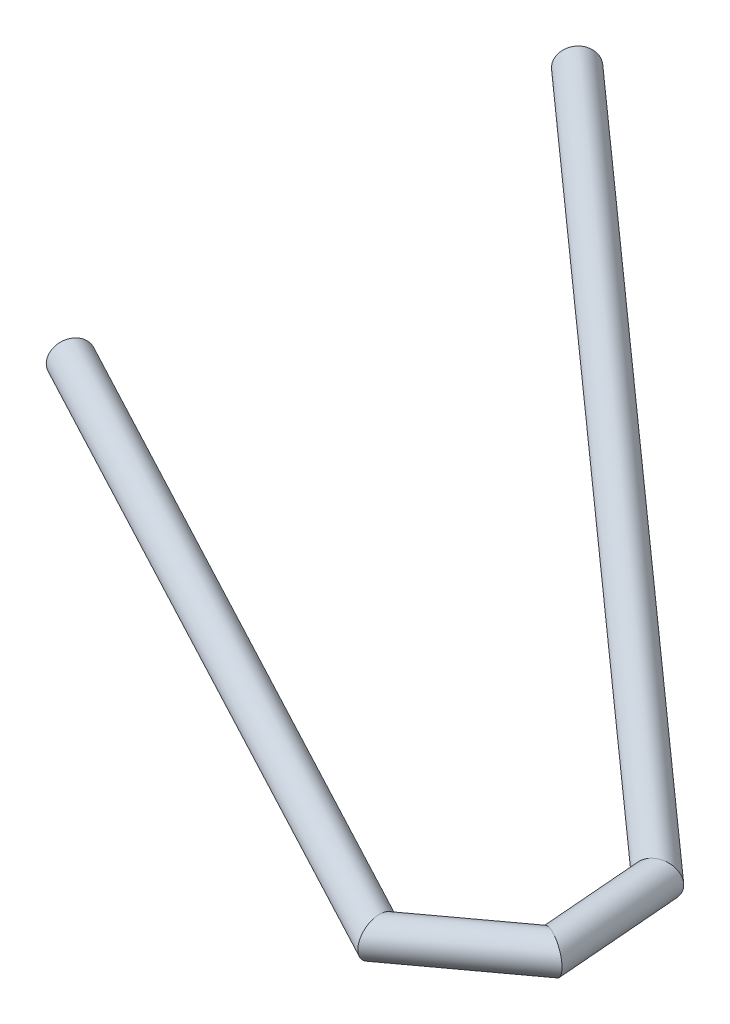
ISO-10303-21;
HEADER;
FILE_DESCRIPTION(('STEP AP214'),'2;1');
FILE_NAME('part.step','',(''),(''),'','','');
FILE_SCHEMA(('AUTOMOTIVE_DESIGN { 1 0 10303 214 1 1 1 1 }'));
ENDSEC;
DATA;
#1=APPLICATION_CONTEXT('core data for automotive mechanical design processes');
#2=APPLICATION_PROTOCOL_DEFINITION('international standard','automotive_design',2000,#1);
#3=PRODUCT_CONTEXT('',#1,'mechanical');
#4=PRODUCT('Part','Part','',(#3));
#5=PRODUCT_RELATED_PRODUCT_CATEGORY('part','',(#4));
#6=PRODUCT_DEFINITION_FORMATION('','',#4);
#7=PRODUCT_DEFINITION_CONTEXT('part definition',#1,'design');
#8=PRODUCT_DEFINITION('design','',#6,#7);
#9=PRODUCT_DEFINITION_SHAPE('','',#8);
#10=(LENGTH_UNIT() NAMED_UNIT(*) SI_UNIT(.MILLI.,.METRE.));
#11=(NAMED_UNIT(*) PLANE_ANGLE_UNIT() SI_UNIT($,.RADIAN.));
#12=(NAMED_UNIT(*) SI_UNIT($,.STERADIAN.) SOLID_ANGLE_UNIT());
#13=UNCERTAINTY_MEASURE_WITH_UNIT(LENGTH_MEASURE(1.E-05),#10,'distance_accuracy_value','');
#14=(GEOMETRIC_REPRESENTATION_CONTEXT(3) GLOBAL_UNCERTAINTY_ASSIGNED_CONTEXT((#13)) GLOBAL_UNIT_ASSIGNED_CONTEXT((#10,
#11,#12)) REPRESENTATION_CONTEXT('',''));
#15=CARTESIAN_POINT('',(0.,0.,0.));
#16=DIRECTION('',(0.,0.,1.));
#17=DIRECTION('',(1.,0.,0.));
#18=AXIS2_PLACEMENT_3D('',#15,#16,#17);
#19=CARTESIAN_POINT('',(86.0208144709434,39.1413999999987,143.574848388901));
#20=DIRECTION('',(-0.883507325351869,0.,-0.468417341747278));
#21=DIRECTION('',(-0.468417341747278,0.,0.883507325351869));
#22=AXIS2_PLACEMENT_3D('',#19,#20,#21);
#23=CYLINDRICAL_SURFACE('',#22,6.352003691545);
#24=CARTESIAN_POINT('',(86.0208144709434,39.1413999999987,143.574848388901));
#25=DIRECTION('',(-0.997298719381176,0.,0.0734524629993255));
#26=DIRECTION('',(0.0734524629993255,0.,0.997298719381176));
#27=AXIS2_PLACEMENT_3D('',#24,#25,#26);
#28=ELLIPSE('',#27,7.50194435886436,6.352003691545);
#29=CARTESIAN_POINT('',(86.5718507613859,39.1413999999987,151.056527890866));
#30=VERTEX_POINT('',#29);
#31=EDGE_CURVE('E39',#30,#30,#28,.F.);
#32=ORIENTED_EDGE('',*,*,#31,.F.);
#33=EDGE_LOOP('',(#32));
#34=FACE_BOUND('',#33,.T.);
#35=CARTESIAN_POINT('',(-141.959662455751,39.1413999999994,22.7043067329527));
#36=DIRECTION('',(-0.883507325351869,0.,-0.468417341747278));
#37=DIRECTION('',(-0.468417341747278,0.,0.883507325351869));
#38=AXIS2_PLACEMENT_3D('',#35,#36,#37);
#39=CIRCLE('',#38,6.352003691545);
#40=CARTESIAN_POINT('',(-144.935051139714,39.1413999999994,28.3163485250948));
#41=VERTEX_POINT('',#40);
#42=EDGE_CURVE('E11',#41,#41,#39,.T.);
#43=ORIENTED_EDGE('',*,*,#42,.F.);
#44=EDGE_LOOP('',(#43));
#45=FACE_BOUND('',#44,.T.);
#46=ADVANCED_FACE('F33',(#34,#45),#23,.T.);
#47=CARTESIAN_POINT('',(120.99943025901,39.1413999999986,117.827610246686));
#48=DIRECTION('',(-0.805346882050248,0.,0.592803845780325));
#49=DIRECTION('',(0.592803845780325,0.,0.805346882050248));
#50=AXIS2_PLACEMENT_3D('',#47,#48,#49);
#51=CYLINDRICAL_SURFACE('',#50,6.352003691545);
#52=CARTESIAN_POINT('',(120.99943025901,39.1413999999986,117.827610246686));
#53=DIRECTION('',(-0.414901199826309,0.,0.909866470633296));
#54=DIRECTION('',(0.909866470633295,0.,0.414901199826309));
#55=AXIS2_PLACEMENT_3D('',#52,#53,#54);
#56=ELLIPSE('',#55,7.27180124684653,6.352003691545);
#57=CARTESIAN_POINT('',(127.615798394625,39.1413999999986,120.844689308901));
#58=VERTEX_POINT('',#57);
#59=EDGE_CURVE('E43',#58,#58,#56,.T.);
#60=ORIENTED_EDGE('',*,*,#59,.T.);
#61=EDGE_LOOP('',(#60));
#62=FACE_BOUND('',#61,.T.);
#63=ORIENTED_EDGE('',*,*,#31,.T.);
#64=EDGE_LOOP('',(#63));
#65=FACE_BOUND('',#64,.T.);
#66=ADVANCED_FACE('F68',(#62,#65),#51,.T.);
#67=CARTESIAN_POINT('',(117.755022381061,39.1413999999986,77.6575931517698));
#68=DIRECTION('',(0.0805047518927316,0.,0.996754224933453));
#69=DIRECTION('',(0.996754224933454,0.,-0.0805047518927316));
#70=AXIS2_PLACEMENT_3D('',#67,#68,#69);
#71=CYLINDRICAL_SURFACE('',#70,6.352003691545);
#72=CARTESIAN_POINT('',(117.755022381061,39.1413999999986,77.6575931517698));
#73=DIRECTION('',(0.445290004855458,0.,0.895386403501765));
#74=DIRECTION('',(-0.895386403501765,0.,0.445290004855458));
#75=AXIS2_PLACEMENT_3D('',#72,#73,#74);
#76=ELLIPSE('',#75,6.84241207840927,6.352003691545);
#77=CARTESIAN_POINT('',(111.628419638897,39.1413999999987,80.7044508593877));
#78=VERTEX_POINT('',#77);
#79=EDGE_CURVE('E47',#78,#78,#76,.F.);
#80=ORIENTED_EDGE('',*,*,#79,.F.);
#81=EDGE_LOOP('',(#80));
#82=FACE_BOUND('',#81,.T.);
#83=ORIENTED_EDGE('',*,*,#59,.F.);
#84=EDGE_LOOP('',(#83));
#85=FACE_BOUND('',#84,.T.);
#86=ADVANCED_FACE('F65',(#82,#85),#71,.T.);
#87=CARTESIAN_POINT('',(-141.959662455751,39.1413999999993,-154.014648133428));
#88=DIRECTION('',(-0.74624573382415,0.,-0.665670567735465));
#89=DIRECTION('',(-0.665670567735465,0.,0.74624573382415));
#90=AXIS2_PLACEMENT_3D('',#87,#88,#89);
#91=PLANE('',#90);
#92=CARTESIAN_POINT('',(-141.959662455751,39.1413999999993,-154.014648133428));
#93=DIRECTION('',(-0.74624573382415,0.,-0.665670567735465));
#94=DIRECTION('',(-0.665670567735465,0.,0.74624573382415));
#95=AXIS2_PLACEMENT_3D('',#92,#93,#94);
#96=CIRCLE('',#95,6.352003691545);
#97=CARTESIAN_POINT('',(-146.18800435936,39.1413999999993,-149.274492477378));
#98=VERTEX_POINT('',#97);
#99=EDGE_CURVE('E52',#98,#98,#96,.T.);
#100=ORIENTED_EDGE('',*,*,#99,.T.);
#101=EDGE_LOOP('',(#100));
#102=FACE_BOUND('',#101,.T.);
#103=ADVANCED_FACE('F56',(#102),#91,.T.);
#104=CARTESIAN_POINT('',(131.162207214154,39.1413999999986,89.6171500846371));
#105=DIRECTION('',(-0.74624573382415,0.,-0.665670567735465));
#106=DIRECTION('',(-0.665670567735465,0.,0.74624573382415));
#107=AXIS2_PLACEMENT_3D('',#104,#105,#106);
#108=CYLINDRICAL_SURFACE('',#107,6.352003691545);
#109=ORIENTED_EDGE('',*,*,#99,.F.);
#110=EDGE_LOOP('',(#109));
#111=FACE_BOUND('',#110,.T.);
#112=ORIENTED_EDGE('',*,*,#79,.T.);
#113=EDGE_LOOP('',(#112));
#114=FACE_BOUND('',#113,.T.);
#115=ADVANCED_FACE('F58',(#111,#114),#108,.T.);
#116=CARTESIAN_POINT('',(-141.959662455751,39.1413999999994,22.7043067329527));
#117=DIRECTION('',(-0.883507325351869,0.,-0.468417341747278));
#118=DIRECTION('',(-0.468417341747278,0.,0.883507325351869));
#119=AXIS2_PLACEMENT_3D('',#116,#117,#118);
#120=PLANE('',#119);
#121=ORIENTED_EDGE('',*,*,#42,.T.);
#122=EDGE_LOOP('',(#121));
#123=FACE_BOUND('',#122,.T.);
#124=ADVANCED_FACE('F61',(#123),#120,.T.);
#125=CLOSED_SHELL('',(#46,#66,#86,#103,#115,#124));
#126=MANIFOLD_SOLID_BREP('B2',#125);
#127=ADVANCED_BREP_SHAPE_REPRESENTATION('',(#18,#126),#14);
#128=SHAPE_DEFINITION_REPRESENTATION(#9,#127);
ENDSEC;
END-ISO-10303-21;
